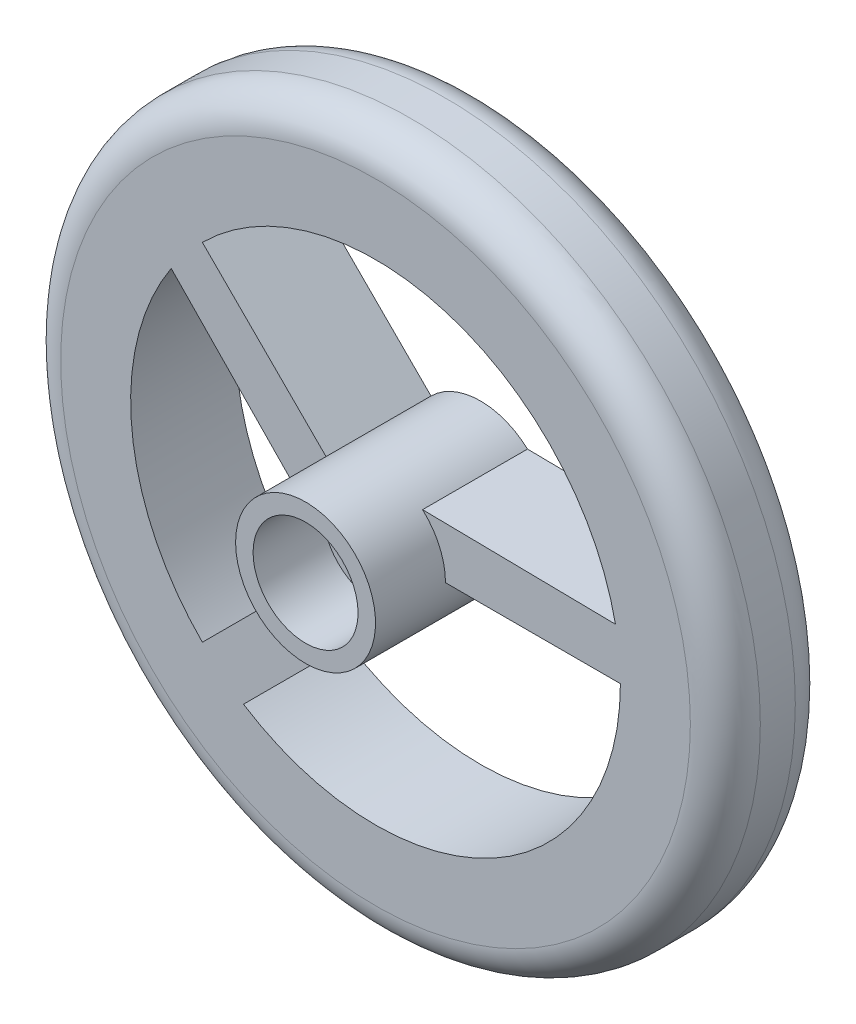
ISO-10303-21;
HEADER;
FILE_DESCRIPTION(('STEP AP214'),'2;1');
FILE_NAME('part.step','',(''),(''),'','','');
FILE_SCHEMA(('AUTOMOTIVE_DESIGN { 1 0 10303 214 1 1 1 1 }'));
ENDSEC;
DATA;
#1=APPLICATION_CONTEXT('core data for automotive mechanical design processes');
#2=APPLICATION_PROTOCOL_DEFINITION('international standard','automotive_design',2000,#1);
#3=PRODUCT_CONTEXT('',#1,'mechanical');
#4=PRODUCT('Part','Part','',(#3));
#5=PRODUCT_RELATED_PRODUCT_CATEGORY('part','',(#4));
#6=PRODUCT_DEFINITION_FORMATION('','',#4);
#7=PRODUCT_DEFINITION_CONTEXT('part definition',#1,'design');
#8=PRODUCT_DEFINITION('design','',#6,#7);
#9=PRODUCT_DEFINITION_SHAPE('','',#8);
#10=(LENGTH_UNIT() NAMED_UNIT(*) SI_UNIT(.MILLI.,.METRE.));
#11=(NAMED_UNIT(*) PLANE_ANGLE_UNIT() SI_UNIT($,.RADIAN.));
#12=(NAMED_UNIT(*) SI_UNIT($,.STERADIAN.) SOLID_ANGLE_UNIT());
#13=UNCERTAINTY_MEASURE_WITH_UNIT(LENGTH_MEASURE(1.E-05),#10,'distance_accuracy_value','');
#14=(GEOMETRIC_REPRESENTATION_CONTEXT(3) GLOBAL_UNCERTAINTY_ASSIGNED_CONTEXT((#13)) GLOBAL_UNIT_ASSIGNED_CONTEXT((#10,
#11,#12)) REPRESENTATION_CONTEXT('',''));
#15=CARTESIAN_POINT('',(0.,0.,0.));
#16=DIRECTION('',(0.,0.,1.));
#17=DIRECTION('',(1.,0.,0.));
#18=AXIS2_PLACEMENT_3D('',#15,#16,#17);
#19=CARTESIAN_POINT('',(-10.758961917046,-10.4497328674483,30.));
#20=DIRECTION('',(-0.71734036356114,-0.696722902455468,0.));
#21=DIRECTION('',(0.696722902455468,-0.71734036356114,0.));
#22=AXIS2_PLACEMENT_3D('',#19,#20,#21);
#23=PLANE('',#22);
#24=DIRECTION('',(-0.696722902455468,0.71734036356114,0.));
#25=VECTOR('',#24,1.);
#26=CARTESIAN_POINT('',(-10.758961917046,-10.4497328674483,30.));
#27=LINE('',#26,#25);
#28=CARTESIAN_POINT('',(-10.6066017177983,-10.6066017177983,30.));
#29=VERTEX_POINT('',#28);
#30=CARTESIAN_POINT('',(-10.9113221162939,-10.2928640170982,30.));
#31=VERTEX_POINT('',#30);
#32=EDGE_CURVE('E213',#29,#31,#27,.T.);
#33=ORIENTED_EDGE('',*,*,#32,.T.);
#34=DIRECTION('',(0.,0.,-1.));
#35=VECTOR('',#34,1.);
#36=CARTESIAN_POINT('',(-10.9113221162939,-10.2928640170982,50.));
#37=LINE('',#36,#35);
#38=CARTESIAN_POINT('',(-10.9113221162939,-10.2928640170982,0.));
#39=VERTEX_POINT('',#38);
#40=EDGE_CURVE('E187',#31,#39,#37,.T.);
#41=ORIENTED_EDGE('',*,*,#40,.T.);
#42=DIRECTION('',(-0.696722902455468,0.71734036356114,0.));
#43=VECTOR('',#42,1.);
#44=CARTESIAN_POINT('',(-10.758961917046,-10.4497328674483,0.));
#45=LINE('',#44,#43);
#46=CARTESIAN_POINT('',(-10.6066017177983,-10.6066017177983,0.));
#47=VERTEX_POINT('',#46);
#48=EDGE_CURVE('E245',#47,#39,#45,.T.);
#49=ORIENTED_EDGE('',*,*,#48,.F.);
#50=DIRECTION('',(0.,0.,-1.));
#51=VECTOR('',#50,1.);
#52=CARTESIAN_POINT('',(-10.6066017177983,-10.6066017177983,30.));
#53=LINE('',#52,#51);
#54=EDGE_CURVE('E267',#29,#47,#53,.T.);
#55=ORIENTED_EDGE('',*,*,#54,.F.);
#56=EDGE_LOOP('',(#33,#41,#49,#55));
#57=FACE_BOUND('',#56,.T.);
#58=ADVANCED_FACE('F41',(#57),#23,.T.);
#59=CARTESIAN_POINT('',(0.218657957910507,14.9968119022317,30.));
#60=DIRECTION('',(0.0145787465586759,0.99989372442714,0.));
#61=DIRECTION('',(-0.99989372442714,0.0145787465586759,0.));
#62=AXIS2_PLACEMENT_3D('',#59,#60,#61);
#63=PLANE('',#62);
#64=DIRECTION('',(0.99989372442714,-0.0145787465586759,0.));
#65=VECTOR('',#64,1.);
#66=CARTESIAN_POINT('',(0.218657957910507,14.9968119022317,30.));
#67=LINE('',#66,#65);
#68=CARTESIAN_POINT('',(0.,15.,30.));
#69=VERTEX_POINT('',#68);
#70=CARTESIAN_POINT('',(0.437315915820933,14.9936238044633,30.));
#71=VERTEX_POINT('',#70);
#72=EDGE_CURVE('E162',#69,#71,#67,.T.);
#73=ORIENTED_EDGE('',*,*,#72,.T.);
#74=DIRECTION('',(0.,0.,-1.));
#75=VECTOR('',#74,1.);
#76=CARTESIAN_POINT('',(0.437315915820933,14.9936238044633,50.));
#77=LINE('',#76,#75);
#78=CARTESIAN_POINT('',(0.437315915820933,14.9936238044633,0.));
#79=VERTEX_POINT('',#78);
#80=EDGE_CURVE('E404',#71,#79,#77,.T.);
#81=ORIENTED_EDGE('',*,*,#80,.T.);
#82=DIRECTION('',(0.99989372442714,-0.0145787465586759,0.));
#83=VECTOR('',#82,1.);
#84=CARTESIAN_POINT('',(0.218657957910507,14.9968119022317,0.));
#85=LINE('',#84,#83);
#86=CARTESIAN_POINT('',(0.,15.,0.));
#87=VERTEX_POINT('',#86);
#88=EDGE_CURVE('E165',#87,#79,#85,.T.);
#89=ORIENTED_EDGE('',*,*,#88,.F.);
#90=DIRECTION('',(0.,0.,-1.));
#91=VECTOR('',#90,1.);
#92=CARTESIAN_POINT('',(0.,15.,30.));
#93=LINE('',#92,#91);
#94=EDGE_CURVE('E159',#69,#87,#93,.T.);
#95=ORIENTED_EDGE('',*,*,#94,.F.);
#96=EDGE_LOOP('',(#73,#81,#89,#95));
#97=FACE_BOUND('',#96,.T.);
#98=ADVANCED_FACE('F161',(#97),#63,.T.);
#99=CARTESIAN_POINT('',(0.,0.,30.));
#100=DIRECTION('',(0.,0.,1.));
#101=DIRECTION('',(1.,0.,0.));
#102=AXIS2_PLACEMENT_3D('',#99,#100,#101);
#103=PLANE('',#102);
#104=CARTESIAN_POINT('',(0.,0.,30.));
#105=DIRECTION('',(0.,0.,1.));
#106=DIRECTION('',(1.,0.,0.));
#107=AXIS2_PLACEMENT_3D('',#104,#105,#106);
#108=CIRCLE('',#107,15.);
#109=EDGE_CURVE('E179',#29,#71,#108,.T.);
#110=ORIENTED_EDGE('',*,*,#109,.T.);
#111=ORIENTED_EDGE('',*,*,#72,.F.);
#112=EDGE_CURVE('E177',#69,#31,#108,.T.);
#113=ORIENTED_EDGE('',*,*,#112,.T.);
#114=ORIENTED_EDGE('',*,*,#32,.F.);
#115=EDGE_LOOP('',(#110,#111,#113,#114));
#116=FACE_BOUND('',#115,.T.);
#117=ADVANCED_FACE('F175',(#116),#103,.T.);
#118=DIRECTION('',(0.,0.,-1.));
#119=VECTOR('',#118,1.);
#120=CARTESIAN_POINT('',(-19.9769988079116,-0.958915339692027,50.));
#121=LINE('',#120,#119);
#122=CARTESIAN_POINT('',(-19.9769988079116,-0.958915339692027,30.));
#123=VERTEX_POINT('',#122);
#124=CARTESIAN_POINT('',(-19.9769988079116,-0.958915339692027,0.));
#125=VERTEX_POINT('',#124);
#126=EDGE_CURVE('E68',#123,#125,#121,.T.);
#127=ORIENTED_EDGE('',*,*,#126,.F.);
#128=CARTESIAN_POINT('',(-58.3969175485404,38.5979276753166,30.));
#129=VERTEX_POINT('',#128);
#130=EDGE_CURVE('E212',#123,#129,#27,.T.);
#131=ORIENTED_EDGE('',*,*,#130,.T.);
#132=DIRECTION('',(0.,0.,-1.));
#133=VECTOR('',#132,1.);
#134=CARTESIAN_POINT('',(-58.3969175485404,38.5979276753166,30.));
#135=LINE('',#134,#133);
#136=CARTESIAN_POINT('',(-58.3969175485404,38.5979276753166,0.));
#137=VERTEX_POINT('',#136);
#138=EDGE_CURVE('E342',#129,#137,#135,.T.);
#139=ORIENTED_EDGE('',*,*,#138,.T.);
#140=EDGE_CURVE('E244',#125,#137,#45,.T.);
#141=ORIENTED_EDGE('',*,*,#140,.F.);
#142=EDGE_LOOP('',(#127,#131,#139,#141));
#143=FACE_BOUND('',#142,.T.);
#144=ADVANCED_FACE('F285',(#143),#23,.T.);
#145=CARTESIAN_POINT('',(0.,0.,30.));
#146=DIRECTION('',(0.707106781186547,-0.707106781186547,0.));
#147=DIRECTION('',(0.707106781186548,0.707106781186548,0.));
#148=AXIS2_PLACEMENT_3D('',#145,#146,#147);
#149=PLANE('',#148);
#150=DIRECTION('',(-0.707106781186548,-0.707106781186548,0.));
#151=VECTOR('',#150,1.);
#152=CARTESIAN_POINT('',(0.,0.,30.));
#153=LINE('',#152,#151);
#154=CARTESIAN_POINT('',(-14.142135623731,-14.142135623731,30.));
#155=VERTEX_POINT('',#154);
#156=CARTESIAN_POINT('',(-49.4971069576443,-49.4971069576443,30.));
#157=VERTEX_POINT('',#156);
#158=EDGE_CURVE('E45',#155,#157,#153,.T.);
#159=ORIENTED_EDGE('',*,*,#158,.F.);
#160=DIRECTION('',(0.,0.,-1.));
#161=VECTOR('',#160,1.);
#162=CARTESIAN_POINT('',(-14.1421356237309,-14.1421356237309,50.));
#163=LINE('',#162,#161);
#164=CARTESIAN_POINT('',(-14.142135623731,-14.142135623731,0.));
#165=VERTEX_POINT('',#164);
#166=EDGE_CURVE('E393',#155,#165,#163,.T.);
#167=ORIENTED_EDGE('',*,*,#166,.T.);
#168=DIRECTION('',(-0.707106781186548,-0.707106781186548,0.));
#169=VECTOR('',#168,1.);
#170=CARTESIAN_POINT('',(0.,0.,0.));
#171=LINE('',#170,#169);
#172=CARTESIAN_POINT('',(-49.4971069576443,-49.4971069576443,0.));
#173=VERTEX_POINT('',#172);
#174=EDGE_CURVE('E249',#165,#173,#171,.T.);
#175=ORIENTED_EDGE('',*,*,#174,.T.);
#176=CARTESIAN_POINT('',(-49.4974746830583,-49.4974746830583,30.));
#177=DIRECTION('',(0.,0.,-1.));
#178=VECTOR('',#177,1.);
#179=LINE('',#176,#178);
#180=EDGE_CURVE('E338',#157,#173,#179,.T.);
#181=ORIENTED_EDGE('',*,*,#180,.F.);
#182=EDGE_LOOP('',(#159,#167,#175,#181));
#183=FACE_BOUND('',#182,.T.);
#184=ADVANCED_FACE('F274',(#183),#149,.F.);
#185=CARTESIAN_POINT('',(10.6066017177983,-10.6066017177981,30.));
#186=DIRECTION('',(0.707106781186552,-0.707106781186543,0.));
#187=DIRECTION('',(0.707106781186543,0.707106781186552,0.));
#188=AXIS2_PLACEMENT_3D('',#185,#186,#187);
#189=PLANE('',#188);
#190=DIRECTION('',(0.,0.,-1.));
#191=VECTOR('',#190,1.);
#192=CARTESIAN_POINT('',(1.25245825086348,-19.9607451847331,50.));
#193=LINE('',#192,#191);
#194=CARTESIAN_POINT('',(1.25245825086348,-19.9607451847331,30.));
#195=VERTEX_POINT('',#194);
#196=CARTESIAN_POINT('',(1.25245825086348,-19.9607451847331,0.));
#197=VERTEX_POINT('',#196);
#198=EDGE_CURVE('E396',#195,#197,#193,.T.);
#199=ORIENTED_EDGE('',*,*,#198,.F.);
#200=DIRECTION('',(-0.707106781186543,-0.707106781186552,0.));
#201=VECTOR('',#200,1.);
#202=CARTESIAN_POINT('',(10.6066017177983,-10.6066017177981,30.));
#203=LINE('',#202,#201);
#204=CARTESIAN_POINT('',(-37.7410972967357,-58.9543007323327,30.));
#205=VERTEX_POINT('',#204);
#206=EDGE_CURVE('E196',#195,#205,#203,.T.);
#207=ORIENTED_EDGE('',*,*,#206,.T.);
#208=DIRECTION('',(0.,0.,-1.));
#209=VECTOR('',#208,1.);
#210=CARTESIAN_POINT('',(-37.7410972967357,-58.9543007323327,30.));
#211=LINE('',#210,#209);
#212=CARTESIAN_POINT('',(-37.7410972967357,-58.9543007323327,0.));
#213=VERTEX_POINT('',#212);
#214=EDGE_CURVE('E171',#205,#213,#211,.T.);
#215=ORIENTED_EDGE('',*,*,#214,.T.);
#216=DIRECTION('',(-0.707106781186543,-0.707106781186552,0.));
#217=VECTOR('',#216,1.);
#218=CARTESIAN_POINT('',(10.6066017177983,-10.6066017177981,0.));
#219=LINE('',#218,#217);
#220=EDGE_CURVE('E234',#197,#213,#219,.T.);
#221=ORIENTED_EDGE('',*,*,#220,.F.);
#222=EDGE_LOOP('',(#199,#207,#215,#221));
#223=FACE_BOUND('',#222,.T.);
#224=ADVANCED_FACE('F284',(#223),#189,.T.);
#225=CARTESIAN_POINT('',(0.,0.,30.));
#226=DIRECTION('',(0.,1.,0.));
#227=DIRECTION('',(0.,0.,1.));
#228=AXIS2_PLACEMENT_3D('',#225,#226,#227);
#229=PLANE('',#228);
#230=DIRECTION('',(1.,0.,0.));
#231=VECTOR('',#230,1.);
#232=CARTESIAN_POINT('',(0.,0.,30.));
#233=LINE('',#232,#231);
#234=CARTESIAN_POINT('',(20.,0.,30.));
#235=VERTEX_POINT('',#234);
#236=CARTESIAN_POINT('',(70.,0.,30.));
#237=VERTEX_POINT('',#236);
#238=EDGE_CURVE('E195',#235,#237,#233,.T.);
#239=ORIENTED_EDGE('',*,*,#238,.F.);
#240=DIRECTION('',(0.,0.,-1.));
#241=VECTOR('',#240,1.);
#242=CARTESIAN_POINT('',(20.,0.,50.));
#243=LINE('',#242,#241);
#244=CARTESIAN_POINT('',(20.,0.,0.));
#245=VERTEX_POINT('',#244);
#246=EDGE_CURVE('E379',#235,#245,#243,.T.);
#247=ORIENTED_EDGE('',*,*,#246,.T.);
#248=DIRECTION('',(1.,0.,0.));
#249=VECTOR('',#248,1.);
#250=CARTESIAN_POINT('',(0.,0.,0.));
#251=LINE('',#250,#249);
#252=CARTESIAN_POINT('',(70.,0.,0.));
#253=VERTEX_POINT('',#252);
#254=EDGE_CURVE('E237',#245,#253,#251,.T.);
#255=ORIENTED_EDGE('',*,*,#254,.T.);
#256=DIRECTION('',(0.,0.,-1.));
#257=VECTOR('',#256,1.);
#258=CARTESIAN_POINT('',(70.,0.,30.));
#259=LINE('',#258,#257);
#260=EDGE_CURVE('E347',#237,#253,#259,.T.);
#261=ORIENTED_EDGE('',*,*,#260,.F.);
#262=EDGE_LOOP('',(#239,#247,#255,#261));
#263=FACE_BOUND('',#262,.T.);
#264=ADVANCED_FACE('F297',(#263),#229,.F.);
#265=DIRECTION('',(0.,0.,-1.));
#266=VECTOR('',#265,1.);
#267=CARTESIAN_POINT('',(13.4478157855499,14.8039268641099,50.));
#268=LINE('',#267,#266);
#269=CARTESIAN_POINT('',(13.4478157855499,14.8039268641099,30.));
#270=VERTEX_POINT('',#269);
#271=CARTESIAN_POINT('',(13.4478157855499,14.8039268641099,0.));
#272=VERTEX_POINT('',#271);
#273=EDGE_CURVE('E382',#270,#272,#268,.T.);
#274=ORIENTED_EDGE('',*,*,#273,.F.);
#275=CARTESIAN_POINT('',(68.585712797929,14.,30.));
#276=VERTEX_POINT('',#275);
#277=EDGE_CURVE('E181',#270,#276,#67,.T.);
#278=ORIENTED_EDGE('',*,*,#277,.T.);
#279=DIRECTION('',(0.,0.,-1.));
#280=VECTOR('',#279,1.);
#281=CARTESIAN_POINT('',(68.585712797929,14.,30.));
#282=LINE('',#281,#280);
#283=CARTESIAN_POINT('',(68.585712797929,14.,0.));
#284=VERTEX_POINT('',#283);
#285=EDGE_CURVE('E221',#276,#284,#282,.T.);
#286=ORIENTED_EDGE('',*,*,#285,.T.);
#287=EDGE_CURVE('E227',#272,#284,#85,.T.);
#288=ORIENTED_EDGE('',*,*,#287,.F.);
#289=EDGE_LOOP('',(#274,#278,#286,#288));
#290=FACE_BOUND('',#289,.T.);
#291=ADVANCED_FACE('F300',(#290),#63,.T.);
#292=CARTESIAN_POINT('',(0.,0.,30.));
#293=DIRECTION('',(-0.707106781186544,-0.707106781186551,0.));
#294=DIRECTION('',(0.707106781186551,-0.707106781186544,0.));
#295=AXIS2_PLACEMENT_3D('',#292,#293,#294);
#296=PLANE('',#295);
#297=DIRECTION('',(-0.707106781186551,0.707106781186544,0.));
#298=VECTOR('',#297,1.);
#299=CARTESIAN_POINT('',(0.,0.,30.));
#300=LINE('',#299,#298);
#301=CARTESIAN_POINT('',(-14.142135623731,14.1421356237309,30.));
#302=VERTEX_POINT('',#301);
#303=CARTESIAN_POINT('',(-49.4974746830586,49.4974746830581,30.));
#304=VERTEX_POINT('',#303);
#305=EDGE_CURVE('E189',#302,#304,#300,.T.);
#306=ORIENTED_EDGE('',*,*,#305,.F.);
#307=DIRECTION('',(0.,0.,-1.));
#308=VECTOR('',#307,1.);
#309=CARTESIAN_POINT('',(-14.142135623731,14.1421356237309,50.));
#310=LINE('',#309,#308);
#311=CARTESIAN_POINT('',(-14.142135623731,14.1421356237309,0.));
#312=VERTEX_POINT('',#311);
#313=EDGE_CURVE('E389',#302,#312,#310,.T.);
#314=ORIENTED_EDGE('',*,*,#313,.T.);
#315=DIRECTION('',(-0.707106781186551,0.707106781186544,0.));
#316=VECTOR('',#315,1.);
#317=CARTESIAN_POINT('',(0.,0.,0.));
#318=LINE('',#317,#316);
#319=CARTESIAN_POINT('',(-49.4974746830586,49.4974746830581,0.));
#320=VERTEX_POINT('',#319);
#321=EDGE_CURVE('E226',#312,#320,#318,.T.);
#322=ORIENTED_EDGE('',*,*,#321,.T.);
#323=DIRECTION('',(0.,0.,-1.));
#324=VECTOR('',#323,1.);
#325=CARTESIAN_POINT('',(-49.4974746830586,49.4974746830581,30.));
#326=LINE('',#325,#324);
#327=EDGE_CURVE('E172',#304,#320,#326,.T.);
#328=ORIENTED_EDGE('',*,*,#327,.F.);
#329=EDGE_LOOP('',(#306,#314,#322,#328));
#330=FACE_BOUND('',#329,.T.);
#331=ADVANCED_FACE('F308',(#330),#296,.F.);
#332=CARTESIAN_POINT('',(0.,0.,30.));
#333=DIRECTION('',(0.,0.,-1.));
#334=DIRECTION('',(-1.,0.,0.));
#335=AXIS2_PLACEMENT_3D('',#332,#333,#334);
#336=CYLINDRICAL_SURFACE('',#335,70.);
#337=CARTESIAN_POINT('',(0.,0.,0.));
#338=DIRECTION('',(0.,0.,1.));
#339=DIRECTION('',(1.,0.,0.));
#340=AXIS2_PLACEMENT_3D('',#337,#338,#339);
#341=CIRCLE('',#340,70.);
#342=EDGE_CURVE('E252',#137,#173,#341,.T.);
#343=ORIENTED_EDGE('',*,*,#342,.F.);
#344=ORIENTED_EDGE('',*,*,#138,.F.);
#345=CARTESIAN_POINT('',(0.,0.,30.));
#346=DIRECTION('',(0.,0.,1.));
#347=DIRECTION('',(1.,0.,0.));
#348=AXIS2_PLACEMENT_3D('',#345,#346,#347);
#349=CIRCLE('',#348,70.);
#350=EDGE_CURVE('E217',#129,#157,#349,.T.);
#351=ORIENTED_EDGE('',*,*,#350,.T.);
#352=ORIENTED_EDGE('',*,*,#180,.T.);
#353=EDGE_LOOP('',(#343,#344,#351,#352));
#354=FACE_BOUND('',#353,.T.);
#355=ADVANCED_FACE('F287',(#354),#336,.F.);
#356=CARTESIAN_POINT('',(0.,0.,30.));
#357=DIRECTION('',(0.,0.,-1.));
#358=DIRECTION('',(-1.,0.,0.));
#359=AXIS2_PLACEMENT_3D('',#356,#357,#358);
#360=CYLINDRICAL_SURFACE('',#359,70.);
#361=CARTESIAN_POINT('',(0.,0.,0.));
#362=DIRECTION('',(0.,0.,1.));
#363=DIRECTION('',(1.,0.,0.));
#364=AXIS2_PLACEMENT_3D('',#361,#362,#363);
#365=CIRCLE('',#364,70.);
#366=EDGE_CURVE('E240',#213,#253,#365,.T.);
#367=ORIENTED_EDGE('',*,*,#366,.F.);
#368=ORIENTED_EDGE('',*,*,#214,.F.);
#369=CARTESIAN_POINT('',(0.,0.,30.));
#370=DIRECTION('',(0.,0.,1.));
#371=DIRECTION('',(1.,0.,0.));
#372=AXIS2_PLACEMENT_3D('',#369,#370,#371);
#373=CIRCLE('',#372,70.);
#374=EDGE_CURVE('E199',#205,#237,#373,.T.);
#375=ORIENTED_EDGE('',*,*,#374,.T.);
#376=ORIENTED_EDGE('',*,*,#260,.T.);
#377=EDGE_LOOP('',(#367,#368,#375,#376));
#378=FACE_BOUND('',#377,.T.);
#379=ADVANCED_FACE('F292',(#378),#360,.F.);
#380=CARTESIAN_POINT('',(0.,0.,30.));
#381=DIRECTION('',(0.,0.,-1.));
#382=DIRECTION('',(-1.,0.,0.));
#383=AXIS2_PLACEMENT_3D('',#380,#381,#382);
#384=CYLINDRICAL_SURFACE('',#383,70.);
#385=CARTESIAN_POINT('',(0.,0.,0.));
#386=DIRECTION('',(0.,0.,1.));
#387=DIRECTION('',(1.,0.,0.));
#388=AXIS2_PLACEMENT_3D('',#385,#386,#387);
#389=CIRCLE('',#388,70.);
#390=EDGE_CURVE('E230',#284,#320,#389,.T.);
#391=ORIENTED_EDGE('',*,*,#390,.F.);
#392=ORIENTED_EDGE('',*,*,#285,.F.);
#393=CARTESIAN_POINT('',(0.,0.,30.));
#394=DIRECTION('',(0.,0.,1.));
#395=DIRECTION('',(1.,0.,0.));
#396=AXIS2_PLACEMENT_3D('',#393,#394,#395);
#397=CIRCLE('',#396,70.);
#398=EDGE_CURVE('E192',#276,#304,#397,.T.);
#399=ORIENTED_EDGE('',*,*,#398,.T.);
#400=ORIENTED_EDGE('',*,*,#327,.T.);
#401=EDGE_LOOP('',(#391,#392,#399,#400));
#402=FACE_BOUND('',#401,.T.);
#403=ADVANCED_FACE('F295',(#402),#384,.F.);
#404=CARTESIAN_POINT('',(0.,0.,30.));
#405=DIRECTION('',(0.,0.,-1.));
#406=DIRECTION('',(-1.,0.,0.));
#407=AXIS2_PLACEMENT_3D('',#404,#405,#406);
#408=CYLINDRICAL_SURFACE('',#407,100.);
#409=CARTESIAN_POINT('',(0.,0.,20.));
#410=DIRECTION('',(0.,0.,1.));
#411=DIRECTION('',(1.,0.,0.));
#412=AXIS2_PLACEMENT_3D('',#409,#410,#411);
#413=CIRCLE('',#412,100.);
#414=CARTESIAN_POINT('',(100.,0.,20.));
#415=VERTEX_POINT('',#414);
#416=EDGE_CURVE('E52',#415,#415,#413,.F.);
#417=ORIENTED_EDGE('',*,*,#416,.T.);
#418=EDGE_LOOP('',(#417));
#419=FACE_BOUND('',#418,.T.);
#420=CARTESIAN_POINT('',(0.,0.,10.));
#421=DIRECTION('',(0.,0.,1.));
#422=DIRECTION('',(1.,0.,0.));
#423=AXIS2_PLACEMENT_3D('',#420,#421,#422);
#424=CIRCLE('',#423,100.);
#425=CARTESIAN_POINT('',(100.,0.,10.));
#426=VERTEX_POINT('',#425);
#427=EDGE_CURVE('E259',#426,#426,#424,.T.);
#428=ORIENTED_EDGE('',*,*,#427,.T.);
#429=EDGE_LOOP('',(#428));
#430=FACE_BOUND('',#429,.T.);
#431=ADVANCED_FACE('F306',(#419,#430),#408,.T.);
#432=CARTESIAN_POINT('',(0.,0.,30.));
#433=DIRECTION('',(0.,0.,1.));
#434=DIRECTION('',(1.,0.,0.));
#435=AXIS2_PLACEMENT_3D('',#432,#433,#434);
#436=CIRCLE('',#435,20.);
#437=EDGE_CURVE('E386',#235,#270,#436,.T.);
#438=ORIENTED_EDGE('',*,*,#437,.F.);
#439=ORIENTED_EDGE('',*,*,#238,.T.);
#440=ORIENTED_EDGE('',*,*,#374,.F.);
#441=ORIENTED_EDGE('',*,*,#206,.F.);
#442=EDGE_CURVE('E60',#155,#195,#436,.T.);
#443=ORIENTED_EDGE('',*,*,#442,.F.);
#444=ORIENTED_EDGE('',*,*,#158,.T.);
#445=ORIENTED_EDGE('',*,*,#350,.F.);
#446=ORIENTED_EDGE('',*,*,#130,.F.);
#447=EDGE_CURVE('E392',#302,#123,#436,.T.);
#448=ORIENTED_EDGE('',*,*,#447,.F.);
#449=ORIENTED_EDGE('',*,*,#305,.T.);
#450=ORIENTED_EDGE('',*,*,#398,.F.);
#451=ORIENTED_EDGE('',*,*,#277,.F.);
#452=EDGE_LOOP('',(#438,#439,#440,#441,#443,#444,#445,#446,#448,#449,#450,#451));
#453=FACE_BOUND('',#452,.T.);
#454=CARTESIAN_POINT('',(0.,0.,30.));
#455=DIRECTION('',(0.,0.,1.));
#456=DIRECTION('',(1.,0.,0.));
#457=AXIS2_PLACEMENT_3D('',#454,#455,#456);
#458=CIRCLE('',#457,90.);
#459=CARTESIAN_POINT('',(90.,0.,30.));
#460=VERTEX_POINT('',#459);
#461=EDGE_CURVE('E263',#460,#460,#458,.T.);
#462=ORIENTED_EDGE('',*,*,#461,.T.);
#463=EDGE_LOOP('',(#462));
#464=FACE_BOUND('',#463,.T.);
#465=ADVANCED_FACE('F324',(#453,#464),#103,.T.);
#466=CARTESIAN_POINT('',(0.,0.,0.));
#467=DIRECTION('',(0.,0.,1.));
#468=DIRECTION('',(1.,0.,0.));
#469=AXIS2_PLACEMENT_3D('',#466,#467,#468);
#470=PLANE('',#469);
#471=CARTESIAN_POINT('',(0.,0.,0.));
#472=DIRECTION('',(0.,0.,-1.));
#473=DIRECTION('',(-1.,0.,0.));
#474=AXIS2_PLACEMENT_3D('',#471,#472,#473);
#475=CIRCLE('',#474,20.);
#476=EDGE_CURVE('E413',#165,#125,#475,.T.);
#477=ORIENTED_EDGE('',*,*,#476,.T.);
#478=ORIENTED_EDGE('',*,*,#140,.T.);
#479=ORIENTED_EDGE('',*,*,#342,.T.);
#480=ORIENTED_EDGE('',*,*,#174,.F.);
#481=EDGE_LOOP('',(#477,#478,#479,#480));
#482=FACE_BOUND('',#481,.T.);
#483=EDGE_CURVE('E412',#245,#197,#475,.T.);
#484=ORIENTED_EDGE('',*,*,#483,.T.);
#485=ORIENTED_EDGE('',*,*,#220,.T.);
#486=ORIENTED_EDGE('',*,*,#366,.T.);
#487=ORIENTED_EDGE('',*,*,#254,.F.);
#488=EDGE_LOOP('',(#484,#485,#486,#487));
#489=FACE_BOUND('',#488,.T.);
#490=EDGE_CURVE('E408',#312,#272,#475,.T.);
#491=ORIENTED_EDGE('',*,*,#490,.T.);
#492=ORIENTED_EDGE('',*,*,#287,.T.);
#493=ORIENTED_EDGE('',*,*,#390,.T.);
#494=ORIENTED_EDGE('',*,*,#321,.F.);
#495=EDGE_LOOP('',(#491,#492,#493,#494));
#496=FACE_BOUND('',#495,.T.);
#497=ORIENTED_EDGE('',*,*,#88,.T.);
#498=CARTESIAN_POINT('',(0.,0.,0.));
#499=DIRECTION('',(0.,0.,-1.));
#500=DIRECTION('',(-1.,0.,0.));
#501=AXIS2_PLACEMENT_3D('',#498,#499,#500);
#502=CIRCLE('',#501,15.);
#503=EDGE_CURVE('E420',#87,#79,#502,.T.);
#504=ORIENTED_EDGE('',*,*,#503,.F.);
#505=EDGE_LOOP('',(#497,#504));
#506=FACE_BOUND('',#505,.T.);
#507=ORIENTED_EDGE('',*,*,#48,.T.);
#508=EDGE_CURVE('E417',#47,#39,#502,.T.);
#509=ORIENTED_EDGE('',*,*,#508,.F.);
#510=EDGE_LOOP('',(#507,#509));
#511=FACE_BOUND('',#510,.T.);
#512=CARTESIAN_POINT('',(0.,0.,0.));
#513=DIRECTION('',(0.,0.,1.));
#514=DIRECTION('',(1.,0.,0.));
#515=AXIS2_PLACEMENT_3D('',#512,#513,#514);
#516=CIRCLE('',#515,90.);
#517=CARTESIAN_POINT('',(90.,0.,0.));
#518=VERTEX_POINT('',#517);
#519=EDGE_CURVE('E11',#518,#518,#516,.F.);
#520=ORIENTED_EDGE('',*,*,#519,.T.);
#521=EDGE_LOOP('',(#520));
#522=FACE_BOUND('',#521,.T.);
#523=ADVANCED_FACE('F316',(#482,#489,#496,#506,#511,#522),#470,.F.);
#524=CARTESIAN_POINT('',(0.,0.,20.));
#525=DIRECTION('',(0.,0.,1.));
#526=DIRECTION('',(1.,0.,0.));
#527=AXIS2_PLACEMENT_3D('',#524,#525,#526);
#528=TOROIDAL_SURFACE('',#527,90.,10.);
#529=ORIENTED_EDGE('',*,*,#416,.F.);
#530=EDGE_LOOP('',(#529));
#531=FACE_BOUND('',#530,.T.);
#532=ORIENTED_EDGE('',*,*,#461,.F.);
#533=EDGE_LOOP('',(#532));
#534=FACE_BOUND('',#533,.T.);
#535=ADVANCED_FACE('F314',(#531,#534),#528,.T.);
#536=CARTESIAN_POINT('',(0.,0.,10.));
#537=DIRECTION('',(0.,0.,1.));
#538=DIRECTION('',(1.,0.,0.));
#539=AXIS2_PLACEMENT_3D('',#536,#537,#538);
#540=TOROIDAL_SURFACE('',#539,90.,10.);
#541=ORIENTED_EDGE('',*,*,#519,.F.);
#542=EDGE_LOOP('',(#541));
#543=FACE_BOUND('',#542,.T.);
#544=ORIENTED_EDGE('',*,*,#427,.F.);
#545=EDGE_LOOP('',(#544));
#546=FACE_BOUND('',#545,.T.);
#547=ADVANCED_FACE('F43',(#543,#546),#540,.T.);
#548=CARTESIAN_POINT('',(0.,0.,50.));
#549=DIRECTION('',(0.,0.,-1.));
#550=DIRECTION('',(-1.,0.,0.));
#551=AXIS2_PLACEMENT_3D('',#548,#549,#550);
#552=CYLINDRICAL_SURFACE('',#551,20.);
#553=CARTESIAN_POINT('',(0.,0.,50.));
#554=DIRECTION('',(0.,0.,-1.));
#555=DIRECTION('',(-1.,0.,0.));
#556=AXIS2_PLACEMENT_3D('',#553,#554,#555);
#557=CIRCLE('',#556,20.);
#558=CARTESIAN_POINT('',(-20.,0.,50.));
#559=VERTEX_POINT('',#558);
#560=EDGE_CURVE('E407',#559,#559,#557,.T.);
#561=ORIENTED_EDGE('',*,*,#560,.T.);
#562=EDGE_LOOP('',(#561));
#563=FACE_BOUND('',#562,.T.);
#564=ORIENTED_EDGE('',*,*,#246,.F.);
#565=ORIENTED_EDGE('',*,*,#437,.T.);
#566=ORIENTED_EDGE('',*,*,#273,.T.);
#567=ORIENTED_EDGE('',*,*,#490,.F.);
#568=ORIENTED_EDGE('',*,*,#313,.F.);
#569=ORIENTED_EDGE('',*,*,#447,.T.);
#570=ORIENTED_EDGE('',*,*,#126,.T.);
#571=ORIENTED_EDGE('',*,*,#476,.F.);
#572=ORIENTED_EDGE('',*,*,#166,.F.);
#573=ORIENTED_EDGE('',*,*,#442,.T.);
#574=ORIENTED_EDGE('',*,*,#198,.T.);
#575=ORIENTED_EDGE('',*,*,#483,.F.);
#576=EDGE_LOOP('',(#564,#565,#566,#567,#568,#569,#570,#571,#572,#573,#574,#575));
#577=FACE_BOUND('',#576,.T.);
#578=ADVANCED_FACE('F322',(#563,#577),#552,.T.);
#579=CARTESIAN_POINT('',(0.,0.,50.));
#580=DIRECTION('',(0.,0.,-1.));
#581=DIRECTION('',(-1.,0.,0.));
#582=AXIS2_PLACEMENT_3D('',#579,#580,#581);
#583=CYLINDRICAL_SURFACE('',#582,15.);
#584=ORIENTED_EDGE('',*,*,#40,.F.);
#585=ORIENTED_EDGE('',*,*,#112,.F.);
#586=ORIENTED_EDGE('',*,*,#94,.T.);
#587=ORIENTED_EDGE('',*,*,#503,.T.);
#588=ORIENTED_EDGE('',*,*,#80,.F.);
#589=ORIENTED_EDGE('',*,*,#109,.F.);
#590=ORIENTED_EDGE('',*,*,#54,.T.);
#591=ORIENTED_EDGE('',*,*,#508,.T.);
#592=EDGE_LOOP('',(#584,#585,#586,#587,#588,#589,#590,#591));
#593=FACE_BOUND('',#592,.T.);
#594=CARTESIAN_POINT('',(0.,0.,50.));
#595=DIRECTION('',(0.,0.,-1.));
#596=DIRECTION('',(-1.,0.,0.));
#597=AXIS2_PLACEMENT_3D('',#594,#595,#596);
#598=CIRCLE('',#597,15.);
#599=CARTESIAN_POINT('',(-15.,0.,50.));
#600=VERTEX_POINT('',#599);
#601=EDGE_CURVE('E421',#600,#600,#598,.T.);
#602=ORIENTED_EDGE('',*,*,#601,.F.);
#603=EDGE_LOOP('',(#602));
#604=FACE_BOUND('',#603,.T.);
#605=ADVANCED_FACE('F184',(#593,#604),#583,.F.);
#606=CARTESIAN_POINT('',(0.,0.,50.));
#607=DIRECTION('',(0.,0.,-1.));
#608=DIRECTION('',(-1.,0.,0.));
#609=AXIS2_PLACEMENT_3D('',#606,#607,#608);
#610=PLANE('',#609);
#611=ORIENTED_EDGE('',*,*,#601,.T.);
#612=EDGE_LOOP('',(#611));
#613=FACE_BOUND('',#612,.T.);
#614=ORIENTED_EDGE('',*,*,#560,.F.);
#615=EDGE_LOOP('',(#614));
#616=FACE_BOUND('',#615,.T.);
#617=ADVANCED_FACE('F445',(#613,#616),#610,.F.);
#618=CLOSED_SHELL('',(#58,#98,#117,#144,#184,#224,#264,#291,#331,#355,#379,#403,#431,#465,#523,
#535,#547,#578,#605,#617));
#619=MANIFOLD_SOLID_BREP('B2',#618);
#620=ADVANCED_BREP_SHAPE_REPRESENTATION('',(#18,#619),#14);
#621=SHAPE_DEFINITION_REPRESENTATION(#9,#620);
ENDSEC;
END-ISO-10303-21;
